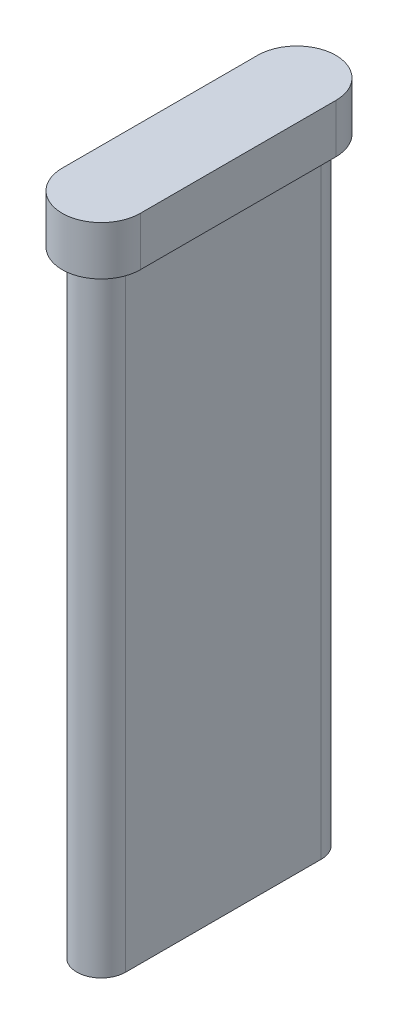
ISO-10303-21;
HEADER;
FILE_DESCRIPTION(('STEP AP214'),'2;1');
FILE_NAME('part.step','',(''),(''),'','','');
FILE_SCHEMA(('AUTOMOTIVE_DESIGN { 1 0 10303 214 1 1 1 1 }'));
ENDSEC;
DATA;
#1=APPLICATION_CONTEXT('core data for automotive mechanical design processes');
#2=APPLICATION_PROTOCOL_DEFINITION('international standard','automotive_design',2000,#1);
#3=PRODUCT_CONTEXT('',#1,'mechanical');
#4=PRODUCT('Part','Part','',(#3));
#5=PRODUCT_RELATED_PRODUCT_CATEGORY('part','',(#4));
#6=PRODUCT_DEFINITION_FORMATION('','',#4);
#7=PRODUCT_DEFINITION_CONTEXT('part definition',#1,'design');
#8=PRODUCT_DEFINITION('design','',#6,#7);
#9=PRODUCT_DEFINITION_SHAPE('','',#8);
#10=(LENGTH_UNIT() NAMED_UNIT(*) SI_UNIT(.MILLI.,.METRE.));
#11=(NAMED_UNIT(*) PLANE_ANGLE_UNIT() SI_UNIT($,.RADIAN.));
#12=(NAMED_UNIT(*) SI_UNIT($,.STERADIAN.) SOLID_ANGLE_UNIT());
#13=UNCERTAINTY_MEASURE_WITH_UNIT(LENGTH_MEASURE(1.E-05),#10,'distance_accuracy_value','');
#14=(GEOMETRIC_REPRESENTATION_CONTEXT(3) GLOBAL_UNCERTAINTY_ASSIGNED_CONTEXT((#13)) GLOBAL_UNIT_ASSIGNED_CONTEXT((#10,
#11,#12)) REPRESENTATION_CONTEXT('',''));
#15=CARTESIAN_POINT('',(0.,0.,0.));
#16=DIRECTION('',(0.,0.,1.));
#17=DIRECTION('',(1.,0.,0.));
#18=AXIS2_PLACEMENT_3D('',#15,#16,#17);
#19=CARTESIAN_POINT('',(0.,-68.,10.));
#20=DIRECTION('',(0.,1.,0.));
#21=DIRECTION('',(0.,0.,1.));
#22=AXIS2_PLACEMENT_3D('',#19,#20,#21);
#23=CYLINDRICAL_SURFACE('',#22,2.5);
#24=DIRECTION('',(0.,1.,0.));
#25=VECTOR('',#24,1.);
#26=CARTESIAN_POINT('',(2.5,-68.,10.));
#27=LINE('',#26,#25);
#28=CARTESIAN_POINT('',(2.5,-68.,10.));
#29=VERTEX_POINT('',#28);
#30=CARTESIAN_POINT('',(2.5,-5.,10.));
#31=VERTEX_POINT('',#30);
#32=EDGE_CURVE('E162',#29,#31,#27,.T.);
#33=ORIENTED_EDGE('',*,*,#32,.T.);
#34=CARTESIAN_POINT('',(0.,-5.,10.));
#35=DIRECTION('',(0.,1.,0.));
#36=DIRECTION('',(0.,0.,1.));
#37=AXIS2_PLACEMENT_3D('',#34,#35,#36);
#38=CIRCLE('',#37,2.5);
#39=CARTESIAN_POINT('',(-2.5,-5.,10.));
#40=VERTEX_POINT('',#39);
#41=EDGE_CURVE('E53',#31,#40,#38,.F.);
#42=ORIENTED_EDGE('',*,*,#41,.T.);
#43=DIRECTION('',(0.,1.,0.));
#44=VECTOR('',#43,1.);
#45=CARTESIAN_POINT('',(-2.5,-68.,10.));
#46=LINE('',#45,#44);
#47=CARTESIAN_POINT('',(-2.5,-68.,10.));
#48=VERTEX_POINT('',#47);
#49=EDGE_CURVE('E46',#48,#40,#46,.T.);
#50=ORIENTED_EDGE('',*,*,#49,.F.);
#51=CARTESIAN_POINT('',(0.,-68.,10.));
#52=DIRECTION('',(0.,1.,0.));
#53=DIRECTION('',(0.,0.,1.));
#54=AXIS2_PLACEMENT_3D('',#51,#52,#53);
#55=CIRCLE('',#54,2.5);
#56=EDGE_CURVE('E151',#48,#29,#55,.T.);
#57=ORIENTED_EDGE('',*,*,#56,.T.);
#58=EDGE_LOOP('',(#33,#42,#50,#57));
#59=FACE_BOUND('',#58,.T.);
#60=ADVANCED_FACE('F39',(#59),#23,.T.);
#61=CARTESIAN_POINT('',(-2.5,-68.,10.));
#62=DIRECTION('',(-1.,0.,0.));
#63=DIRECTION('',(0.,0.,1.));
#64=AXIS2_PLACEMENT_3D('',#61,#62,#63);
#65=PLANE('',#64);
#66=ORIENTED_EDGE('',*,*,#49,.T.);
#67=DIRECTION('',(0.,0.,-1.));
#68=VECTOR('',#67,1.);
#69=CARTESIAN_POINT('',(-2.5,-5.,10.));
#70=LINE('',#69,#68);
#71=CARTESIAN_POINT('',(-2.50000000000001,-5.,-10.));
#72=VERTEX_POINT('',#71);
#73=EDGE_CURVE('E147',#40,#72,#70,.T.);
#74=ORIENTED_EDGE('',*,*,#73,.T.);
#75=DIRECTION('',(0.,1.,0.));
#76=VECTOR('',#75,1.);
#77=CARTESIAN_POINT('',(-2.50000000000001,-68.,-10.));
#78=LINE('',#77,#76);
#79=CARTESIAN_POINT('',(-2.50000000000001,-68.,-10.));
#80=VERTEX_POINT('',#79);
#81=EDGE_CURVE('E164',#80,#72,#78,.T.);
#82=ORIENTED_EDGE('',*,*,#81,.F.);
#83=DIRECTION('',(0.,0.,1.));
#84=VECTOR('',#83,1.);
#85=CARTESIAN_POINT('',(-2.5,-68.,10.));
#86=LINE('',#85,#84);
#87=EDGE_CURVE('E159',#80,#48,#86,.T.);
#88=ORIENTED_EDGE('',*,*,#87,.T.);
#89=EDGE_LOOP('',(#66,#74,#82,#88));
#90=FACE_BOUND('',#89,.T.);
#91=ADVANCED_FACE('F180',(#90),#65,.T.);
#92=CARTESIAN_POINT('',(0.,-68.,-10.));
#93=DIRECTION('',(0.,1.,0.));
#94=DIRECTION('',(0.,0.,1.));
#95=AXIS2_PLACEMENT_3D('',#92,#93,#94);
#96=CYLINDRICAL_SURFACE('',#95,2.5);
#97=ORIENTED_EDGE('',*,*,#81,.T.);
#98=CARTESIAN_POINT('',(0.,-5.,-10.));
#99=DIRECTION('',(0.,1.,0.));
#100=DIRECTION('',(0.,0.,1.));
#101=AXIS2_PLACEMENT_3D('',#98,#99,#100);
#102=CIRCLE('',#101,2.5);
#103=CARTESIAN_POINT('',(2.5,-5.,-10.));
#104=VERTEX_POINT('',#103);
#105=EDGE_CURVE('E141',#72,#104,#102,.F.);
#106=ORIENTED_EDGE('',*,*,#105,.T.);
#107=DIRECTION('',(0.,1.,0.));
#108=VECTOR('',#107,1.);
#109=CARTESIAN_POINT('',(2.5,-68.,-10.));
#110=LINE('',#109,#108);
#111=CARTESIAN_POINT('',(2.5,-68.,-10.));
#112=VERTEX_POINT('',#111);
#113=EDGE_CURVE('E167',#112,#104,#110,.T.);
#114=ORIENTED_EDGE('',*,*,#113,.F.);
#115=CARTESIAN_POINT('',(0.,-68.,-10.));
#116=DIRECTION('',(0.,1.,0.));
#117=DIRECTION('',(0.,0.,1.));
#118=AXIS2_PLACEMENT_3D('',#115,#116,#117);
#119=CIRCLE('',#118,2.5);
#120=EDGE_CURVE('E156',#112,#80,#119,.T.);
#121=ORIENTED_EDGE('',*,*,#120,.T.);
#122=EDGE_LOOP('',(#97,#106,#114,#121));
#123=FACE_BOUND('',#122,.T.);
#124=ADVANCED_FACE('F178',(#123),#96,.T.);
#125=CARTESIAN_POINT('',(2.5,-68.,10.));
#126=DIRECTION('',(1.,0.,0.));
#127=DIRECTION('',(0.,0.,-1.));
#128=AXIS2_PLACEMENT_3D('',#125,#126,#127);
#129=PLANE('',#128);
#130=ORIENTED_EDGE('',*,*,#113,.T.);
#131=DIRECTION('',(0.,0.,1.));
#132=VECTOR('',#131,1.);
#133=CARTESIAN_POINT('',(2.5,-5.,10.));
#134=LINE('',#133,#132);
#135=EDGE_CURVE('E11',#104,#31,#134,.T.);
#136=ORIENTED_EDGE('',*,*,#135,.T.);
#137=ORIENTED_EDGE('',*,*,#32,.F.);
#138=DIRECTION('',(0.,0.,-1.));
#139=VECTOR('',#138,1.);
#140=CARTESIAN_POINT('',(2.5,-68.,10.));
#141=LINE('',#140,#139);
#142=EDGE_CURVE('E153',#29,#112,#141,.T.);
#143=ORIENTED_EDGE('',*,*,#142,.T.);
#144=EDGE_LOOP('',(#130,#136,#137,#143));
#145=FACE_BOUND('',#144,.T.);
#146=ADVANCED_FACE('F172',(#145),#129,.T.);
#147=CARTESIAN_POINT('',(0.,-68.,10.));
#148=DIRECTION('',(0.,1.,0.));
#149=DIRECTION('',(0.,0.,1.));
#150=AXIS2_PLACEMENT_3D('',#147,#148,#149);
#151=PLANE('',#150);
#152=ORIENTED_EDGE('',*,*,#56,.F.);
#153=ORIENTED_EDGE('',*,*,#87,.F.);
#154=ORIENTED_EDGE('',*,*,#120,.F.);
#155=ORIENTED_EDGE('',*,*,#142,.F.);
#156=EDGE_LOOP('',(#152,#153,#154,#155));
#157=FACE_BOUND('',#156,.T.);
#158=ADVANCED_FACE('F175',(#157),#151,.F.);
#159=CARTESIAN_POINT('',(0.,-5.,10.));
#160=DIRECTION('',(0.,1.,0.));
#161=DIRECTION('',(0.,0.,1.));
#162=AXIS2_PLACEMENT_3D('',#159,#160,#161);
#163=CYLINDRICAL_SURFACE('',#162,4.);
#164=CARTESIAN_POINT('',(0.,0.,10.));
#165=DIRECTION('',(0.,1.,0.));
#166=DIRECTION('',(0.,0.,1.));
#167=AXIS2_PLACEMENT_3D('',#164,#165,#166);
#168=CIRCLE('',#167,4.);
#169=CARTESIAN_POINT('',(-4.,0.,10.));
#170=VERTEX_POINT('',#169);
#171=CARTESIAN_POINT('',(4.,0.,10.));
#172=VERTEX_POINT('',#171);
#173=EDGE_CURVE('E135',#170,#172,#168,.T.);
#174=ORIENTED_EDGE('',*,*,#173,.F.);
#175=DIRECTION('',(0.,1.,0.));
#176=VECTOR('',#175,1.);
#177=CARTESIAN_POINT('',(-4.,-5.,10.));
#178=LINE('',#177,#176);
#179=CARTESIAN_POINT('',(-4.,-5.,10.));
#180=VERTEX_POINT('',#179);
#181=EDGE_CURVE('E126',#180,#170,#178,.T.);
#182=ORIENTED_EDGE('',*,*,#181,.F.);
#183=CARTESIAN_POINT('',(0.,-5.,10.));
#184=DIRECTION('',(0.,1.,0.));
#185=DIRECTION('',(0.,0.,1.));
#186=AXIS2_PLACEMENT_3D('',#183,#184,#185);
#187=CIRCLE('',#186,4.);
#188=CARTESIAN_POINT('',(4.,-5.,10.));
#189=VERTEX_POINT('',#188);
#190=EDGE_CURVE('E120',#180,#189,#187,.T.);
#191=ORIENTED_EDGE('',*,*,#190,.T.);
#192=DIRECTION('',(0.,1.,0.));
#193=VECTOR('',#192,1.);
#194=CARTESIAN_POINT('',(4.,-5.,10.));
#195=LINE('',#194,#193);
#196=EDGE_CURVE('E102',#189,#172,#195,.T.);
#197=ORIENTED_EDGE('',*,*,#196,.T.);
#198=EDGE_LOOP('',(#174,#182,#191,#197));
#199=FACE_BOUND('',#198,.T.);
#200=ADVANCED_FACE('F125',(#199),#163,.T.);
#201=CARTESIAN_POINT('',(-4.00000000000001,-5.,-10.));
#202=DIRECTION('',(-1.,0.,0.));
#203=DIRECTION('',(0.,0.,1.));
#204=AXIS2_PLACEMENT_3D('',#201,#202,#203);
#205=PLANE('',#204);
#206=DIRECTION('',(0.,0.,1.));
#207=VECTOR('',#206,1.);
#208=CARTESIAN_POINT('',(-4.00000000000001,0.,-10.));
#209=LINE('',#208,#207);
#210=CARTESIAN_POINT('',(-4.00000000000001,0.,-10.));
#211=VERTEX_POINT('',#210);
#212=EDGE_CURVE('E127',#211,#170,#209,.T.);
#213=ORIENTED_EDGE('',*,*,#212,.F.);
#214=DIRECTION('',(0.,1.,0.));
#215=VECTOR('',#214,1.);
#216=CARTESIAN_POINT('',(-4.00000000000001,-5.,-10.));
#217=LINE('',#216,#215);
#218=CARTESIAN_POINT('',(-4.00000000000001,-5.,-10.));
#219=VERTEX_POINT('',#218);
#220=EDGE_CURVE('E142',#219,#211,#217,.T.);
#221=ORIENTED_EDGE('',*,*,#220,.F.);
#222=DIRECTION('',(0.,0.,1.));
#223=VECTOR('',#222,1.);
#224=CARTESIAN_POINT('',(-4.00000000000001,-5.,-10.));
#225=LINE('',#224,#223);
#226=EDGE_CURVE('E113',#219,#180,#225,.T.);
#227=ORIENTED_EDGE('',*,*,#226,.T.);
#228=ORIENTED_EDGE('',*,*,#181,.T.);
#229=EDGE_LOOP('',(#213,#221,#227,#228));
#230=FACE_BOUND('',#229,.T.);
#231=ADVANCED_FACE('F198',(#230),#205,.T.);
#232=CARTESIAN_POINT('',(0.,-5.,-10.));
#233=DIRECTION('',(0.,1.,0.));
#234=DIRECTION('',(0.,0.,1.));
#235=AXIS2_PLACEMENT_3D('',#232,#233,#234);
#236=CYLINDRICAL_SURFACE('',#235,4.);
#237=CARTESIAN_POINT('',(0.,0.,-10.));
#238=DIRECTION('',(0.,1.,0.));
#239=DIRECTION('',(0.,0.,1.));
#240=AXIS2_PLACEMENT_3D('',#237,#238,#239);
#241=CIRCLE('',#240,4.);
#242=CARTESIAN_POINT('',(4.,0.,-10.));
#243=VERTEX_POINT('',#242);
#244=EDGE_CURVE('E130',#243,#211,#241,.T.);
#245=ORIENTED_EDGE('',*,*,#244,.F.);
#246=DIRECTION('',(0.,1.,0.));
#247=VECTOR('',#246,1.);
#248=CARTESIAN_POINT('',(4.,-5.,-10.));
#249=LINE('',#248,#247);
#250=CARTESIAN_POINT('',(4.,-5.,-10.));
#251=VERTEX_POINT('',#250);
#252=EDGE_CURVE('E112',#251,#243,#249,.T.);
#253=ORIENTED_EDGE('',*,*,#252,.F.);
#254=CARTESIAN_POINT('',(0.,-5.,-10.));
#255=DIRECTION('',(0.,1.,0.));
#256=DIRECTION('',(0.,0.,1.));
#257=AXIS2_PLACEMENT_3D('',#254,#255,#256);
#258=CIRCLE('',#257,4.);
#259=EDGE_CURVE('E123',#251,#219,#258,.T.);
#260=ORIENTED_EDGE('',*,*,#259,.T.);
#261=ORIENTED_EDGE('',*,*,#220,.T.);
#262=EDGE_LOOP('',(#245,#253,#260,#261));
#263=FACE_BOUND('',#262,.T.);
#264=ADVANCED_FACE('F203',(#263),#236,.T.);
#265=CARTESIAN_POINT('',(4.,-5.,10.));
#266=DIRECTION('',(1.,0.,0.));
#267=DIRECTION('',(0.,0.,-1.));
#268=AXIS2_PLACEMENT_3D('',#265,#266,#267);
#269=PLANE('',#268);
#270=DIRECTION('',(0.,0.,-1.));
#271=VECTOR('',#270,1.);
#272=CARTESIAN_POINT('',(4.,0.,10.));
#273=LINE('',#272,#271);
#274=EDGE_CURVE('E107',#172,#243,#273,.T.);
#275=ORIENTED_EDGE('',*,*,#274,.F.);
#276=ORIENTED_EDGE('',*,*,#196,.F.);
#277=DIRECTION('',(0.,0.,-1.));
#278=VECTOR('',#277,1.);
#279=CARTESIAN_POINT('',(4.,-5.,10.));
#280=LINE('',#279,#278);
#281=EDGE_CURVE('E105',#189,#251,#280,.T.);
#282=ORIENTED_EDGE('',*,*,#281,.T.);
#283=ORIENTED_EDGE('',*,*,#252,.T.);
#284=EDGE_LOOP('',(#275,#276,#282,#283));
#285=FACE_BOUND('',#284,.T.);
#286=ADVANCED_FACE('F104',(#285),#269,.T.);
#287=CARTESIAN_POINT('',(0.,-5.,10.));
#288=DIRECTION('',(0.,1.,0.));
#289=DIRECTION('',(0.,0.,1.));
#290=AXIS2_PLACEMENT_3D('',#287,#288,#289);
#291=PLANE('',#290);
#292=ORIENTED_EDGE('',*,*,#41,.F.);
#293=ORIENTED_EDGE('',*,*,#135,.F.);
#294=ORIENTED_EDGE('',*,*,#105,.F.);
#295=ORIENTED_EDGE('',*,*,#73,.F.);
#296=EDGE_LOOP('',(#292,#293,#294,#295));
#297=FACE_BOUND('',#296,.T.);
#298=ORIENTED_EDGE('',*,*,#190,.F.);
#299=ORIENTED_EDGE('',*,*,#226,.F.);
#300=ORIENTED_EDGE('',*,*,#259,.F.);
#301=ORIENTED_EDGE('',*,*,#281,.F.);
#302=EDGE_LOOP('',(#298,#299,#300,#301));
#303=FACE_BOUND('',#302,.T.);
#304=ADVANCED_FACE('F118',(#297,#303),#291,.F.);
#305=CARTESIAN_POINT('',(0.,0.,10.));
#306=DIRECTION('',(0.,1.,0.));
#307=DIRECTION('',(0.,0.,1.));
#308=AXIS2_PLACEMENT_3D('',#305,#306,#307);
#309=PLANE('',#308);
#310=ORIENTED_EDGE('',*,*,#173,.T.);
#311=ORIENTED_EDGE('',*,*,#274,.T.);
#312=ORIENTED_EDGE('',*,*,#244,.T.);
#313=ORIENTED_EDGE('',*,*,#212,.T.);
#314=EDGE_LOOP('',(#310,#311,#312,#313));
#315=FACE_BOUND('',#314,.T.);
#316=ADVANCED_FACE('F189',(#315),#309,.T.);
#317=CLOSED_SHELL('',(#60,#91,#124,#146,#158,#200,#231,#264,#286,#304,#316));
#318=MANIFOLD_SOLID_BREP('B2',#317);
#319=ADVANCED_BREP_SHAPE_REPRESENTATION('',(#18,#318),#14);
#320=SHAPE_DEFINITION_REPRESENTATION(#9,#319);
ENDSEC;
END-ISO-10303-21;
